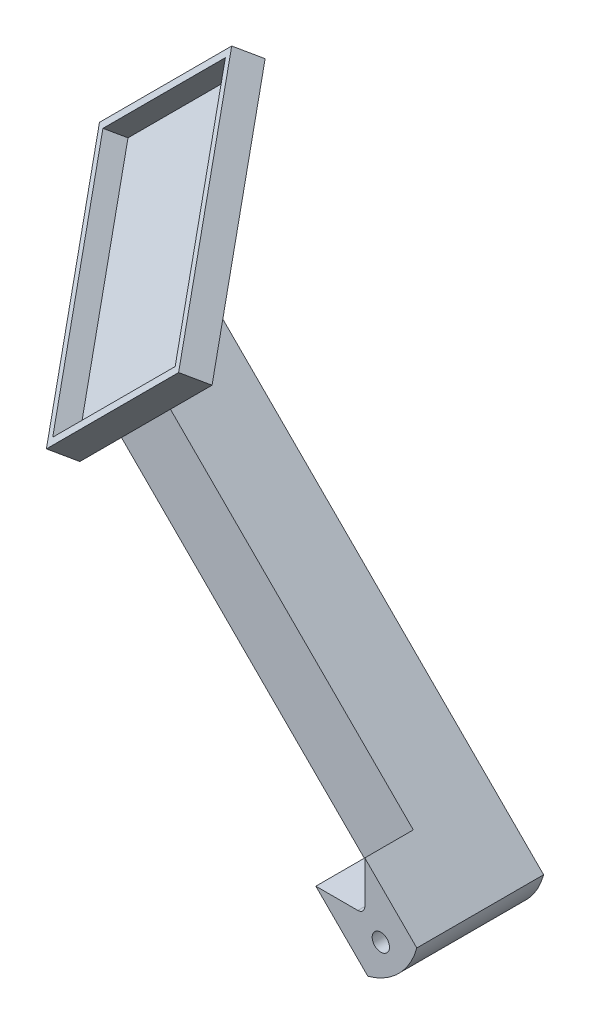
ISO-10303-21;
HEADER;
FILE_DESCRIPTION(('STEP AP214'),'2;1');
FILE_NAME('part.step','',(''),(''),'','','');
FILE_SCHEMA(('AUTOMOTIVE_DESIGN { 1 0 10303 214 1 1 1 1 }'));
ENDSEC;
DATA;
#1=APPLICATION_CONTEXT('core data for automotive mechanical design processes');
#2=APPLICATION_PROTOCOL_DEFINITION('international standard','automotive_design',2000,#1);
#3=PRODUCT_CONTEXT('',#1,'mechanical');
#4=PRODUCT('Part','Part','',(#3));
#5=PRODUCT_RELATED_PRODUCT_CATEGORY('part','',(#4));
#6=PRODUCT_DEFINITION_FORMATION('','',#4);
#7=PRODUCT_DEFINITION_CONTEXT('part definition',#1,'design');
#8=PRODUCT_DEFINITION('design','',#6,#7);
#9=PRODUCT_DEFINITION_SHAPE('','',#8);
#10=(LENGTH_UNIT() NAMED_UNIT(*) SI_UNIT(.MILLI.,.METRE.));
#11=(NAMED_UNIT(*) PLANE_ANGLE_UNIT() SI_UNIT($,.RADIAN.));
#12=(NAMED_UNIT(*) SI_UNIT($,.STERADIAN.) SOLID_ANGLE_UNIT());
#13=UNCERTAINTY_MEASURE_WITH_UNIT(LENGTH_MEASURE(1.E-05),#10,'distance_accuracy_value','');
#14=(GEOMETRIC_REPRESENTATION_CONTEXT(3) GLOBAL_UNCERTAINTY_ASSIGNED_CONTEXT((#13)) GLOBAL_UNIT_ASSIGNED_CONTEXT((#10,
#11,#12)) REPRESENTATION_CONTEXT('',''));
#15=CARTESIAN_POINT('',(0.,0.,0.));
#16=DIRECTION('',(0.,0.,1.));
#17=DIRECTION('',(1.,0.,0.));
#18=AXIS2_PLACEMENT_3D('',#15,#16,#17);
#19=CARTESIAN_POINT('',(-16.5000000000001,58.0000000000001,-5.));
#20=DIRECTION('',(0.,0.,-1.));
#21=DIRECTION('',(-1.,0.,0.));
#22=AXIS2_PLACEMENT_3D('',#19,#20,#21);
#23=PLANE('',#22);
#24=CARTESIAN_POINT('',(48.0000000000001,-48.0000000000001,-5.));
#25=DIRECTION('',(0.,0.,-1.));
#26=DIRECTION('',(-1.,0.,0.));
#27=AXIS2_PLACEMENT_3D('',#24,#25,#26);
#28=CIRCLE('',#27,10.);
#29=CARTESIAN_POINT('',(50.5881904510253,-57.6592582628908,-5.));
#30=VERTEX_POINT('',#29);
#31=CARTESIAN_POINT('',(57.6592582628908,-50.5881904510253,-5.));
#32=VERTEX_POINT('',#31);
#33=EDGE_CURVE('E164',#30,#32,#28,.F.);
#34=ORIENTED_EDGE('',*,*,#33,.T.);
#35=DIRECTION('',(0.707106781186548,-0.707106781186547,0.));
#36=VECTOR('',#35,1.);
#37=CARTESIAN_POINT('',(53.6874140659327,-46.6163462540672,-5.));
#38=LINE('',#37,#36);
#39=CARTESIAN_POINT('',(50.15188016,-43.0808123481345,-5.));
#40=VERTEX_POINT('',#39);
#41=EDGE_CURVE('E185',#40,#32,#38,.T.);
#42=ORIENTED_EDGE('',*,*,#41,.F.);
#43=DIRECTION('',(0.,-1.,0.));
#44=VECTOR('',#43,1.);
#45=CARTESIAN_POINT('',(50.15188016,0.,-5.));
#46=LINE('',#45,#44);
#47=CARTESIAN_POINT('',(50.15188016,-49.15188016,-5.));
#48=VERTEX_POINT('',#47);
#49=EDGE_CURVE('E53',#40,#48,#46,.T.);
#50=ORIENTED_EDGE('',*,*,#49,.T.);
#51=CARTESIAN_POINT('',(49.15188016,-49.15188016,-5.));
#52=DIRECTION('',(0.,0.,-1.));
#53=DIRECTION('',(-1.,0.,0.));
#54=AXIS2_PLACEMENT_3D('',#51,#52,#53);
#55=CIRCLE('',#54,1.);
#56=CARTESIAN_POINT('',(49.15188016,-50.15188016,-5.));
#57=VERTEX_POINT('',#56);
#58=EDGE_CURVE('E168',#57,#48,#55,.F.);
#59=ORIENTED_EDGE('',*,*,#58,.F.);
#60=DIRECTION('',(-1.,0.,0.));
#61=VECTOR('',#60,1.);
#62=CARTESIAN_POINT('',(0.,-50.15188016,-5.));
#63=LINE('',#62,#61);
#64=CARTESIAN_POINT('',(43.0808123481345,-50.15188016,-5.));
#65=VERTEX_POINT('',#64);
#66=EDGE_CURVE('E166',#57,#65,#63,.T.);
#67=ORIENTED_EDGE('',*,*,#66,.T.);
#68=DIRECTION('',(0.707106781186548,-0.707106781186547,0.));
#69=VECTOR('',#68,1.);
#70=CARTESIAN_POINT('',(46.6163462540672,-53.6874140659327,-5.));
#71=LINE('',#70,#69);
#72=EDGE_CURVE('E40',#65,#30,#71,.T.);
#73=ORIENTED_EDGE('',*,*,#72,.T.);
#74=EDGE_LOOP('',(#34,#42,#50,#59,#67,#73));
#75=FACE_BOUND('',#74,.T.);
#76=CARTESIAN_POINT('',(52.4653793231931,-52.4653793231931,-5.));
#77=DIRECTION('',(0.,0.,-1.));
#78=DIRECTION('',(-1.,0.,0.));
#79=AXIS2_PLACEMENT_3D('',#76,#77,#78);
#80=CIRCLE('',#79,1.24999999999999);
#81=CARTESIAN_POINT('',(51.2153793231931,-52.4653793231931,-5.));
#82=VERTEX_POINT('',#81);
#83=EDGE_CURVE('E294',#82,#82,#80,.F.);
#84=ORIENTED_EDGE('',*,*,#83,.F.);
#85=EDGE_LOOP('',(#84));
#86=FACE_BOUND('',#85,.T.);
#87=ADVANCED_FACE('F37',(#75,#86),#23,.F.);
#88=CARTESIAN_POINT('',(9.51771845904715,-9.51771845904715,-13.4600865276334));
#89=DIRECTION('',(-0.499999999999996,0.499999999999996,0.707106781186553));
#90=DIRECTION('',(0.81649658092773,0.,0.57735026918962));
#91=AXIS2_PLACEMENT_3D('',#88,#89,#90);
#92=PLANE('',#91);
#93=DIRECTION('',(0.707106781186547,0.707106781186548,0.));
#94=VECTOR('',#93,1.);
#95=CARTESIAN_POINT('',(10.5501555438559,-10.5501555438559,-12.));
#96=LINE('',#95,#94);
#97=CARTESIAN_POINT('',(1.71132077902406,-19.3889903086877,-12.));
#98=VERTEX_POINT('',#97);
#99=CARTESIAN_POINT('',(19.3889903086877,-1.71132077902405,-12.));
#100=VERTEX_POINT('',#99);
#101=EDGE_CURVE('E45',#98,#100,#96,.T.);
#102=ORIENTED_EDGE('',*,*,#101,.T.);
#103=DIRECTION('',(-0.500000000000004,0.500000000000003,-0.707106781186542));
#104=VECTOR('',#103,1.);
#105=CARTESIAN_POINT('',(18.356553223879,-0.678883694215297,-13.4600865276334));
#106=LINE('',#105,#104);
#107=CARTESIAN_POINT('',(1.88899030868757,15.7886792209761,-36.748737341529));
#108=VERTEX_POINT('',#107);
#109=EDGE_CURVE('E246',#100,#108,#106,.T.);
#110=ORIENTED_EDGE('',*,*,#109,.T.);
#111=DIRECTION('',(-0.707106781186547,-0.707106781186548,0.));
#112=VECTOR('',#111,1.);
#113=CARTESIAN_POINT('',(-6.94984445614426,6.94984445614423,-36.748737341529));
#114=LINE('',#113,#112);
#115=CARTESIAN_POINT('',(-15.7886792209761,-1.88899030868762,-36.748737341529));
#116=VERTEX_POINT('',#115);
#117=EDGE_CURVE('E243',#108,#116,#114,.T.);
#118=ORIENTED_EDGE('',*,*,#117,.T.);
#119=DIRECTION('',(0.500000000000004,-0.500000000000003,0.707106781186542));
#120=VECTOR('',#119,1.);
#121=CARTESIAN_POINT('',(0.678883694215319,-18.356553223879,-13.4600865276334));
#122=LINE('',#121,#120);
#123=EDGE_CURVE('E240',#116,#98,#122,.T.);
#124=ORIENTED_EDGE('',*,*,#123,.T.);
#125=EDGE_LOOP('',(#102,#110,#118,#124));
#126=FACE_BOUND('',#125,.T.);
#127=ADVANCED_FACE('F303',(#126),#92,.T.);
#128=CARTESIAN_POINT('',(0.388990308687586,17.2886792209761,-34.6274169979693));
#129=DIRECTION('',(0.500000000000004,-0.500000000000003,0.707106781186542));
#130=DIRECTION('',(0.816496580927722,0.,-0.577350269189632));
#131=AXIS2_PLACEMENT_3D('',#128,#129,#130);
#132=PLANE('',#131);
#133=ORIENTED_EDGE('',*,*,#117,.F.);
#134=DIRECTION('',(0.499999999999996,-0.499999999999996,-0.707106781186553));
#135=VECTOR('',#134,1.);
#136=CARTESIAN_POINT('',(0.388990308687586,17.2886792209761,-34.6274169979693));
#137=LINE('',#136,#135);
#138=CARTESIAN_POINT('',(0.388990308687586,17.2886792209761,-34.6274169979693));
#139=VERTEX_POINT('',#138);
#140=EDGE_CURVE('E214',#139,#108,#137,.T.);
#141=ORIENTED_EDGE('',*,*,#140,.F.);
#142=DIRECTION('',(-0.707106781186547,-0.707106781186548,0.));
#143=VECTOR('',#142,1.);
#144=CARTESIAN_POINT('',(0.388990308687586,17.2886792209761,-34.6274169979693));
#145=LINE('',#144,#143);
#146=CARTESIAN_POINT('',(-17.2886792209761,-0.388990308687629,-34.6274169979693));
#147=VERTEX_POINT('',#146);
#148=EDGE_CURVE('E236',#139,#147,#145,.T.);
#149=ORIENTED_EDGE('',*,*,#148,.T.);
#150=DIRECTION('',(0.499999999999996,-0.499999999999996,-0.707106781186553));
#151=VECTOR('',#150,1.);
#152=CARTESIAN_POINT('',(-17.2886792209761,-0.388990308687629,-34.6274169979693));
#153=LINE('',#152,#151);
#154=EDGE_CURVE('E224',#147,#116,#153,.T.);
#155=ORIENTED_EDGE('',*,*,#154,.T.);
#156=EDGE_LOOP('',(#133,#141,#149,#155));
#157=FACE_BOUND('',#156,.T.);
#158=ADVANCED_FACE('F307',(#157),#132,.T.);
#159=CARTESIAN_POINT('',(-17.2886792209761,-0.388990308687629,-34.6274169979693));
#160=DIRECTION('',(0.707106781186547,0.707106781186548,0.));
#161=DIRECTION('',(-0.707106781186548,0.707106781186547,0.));
#162=AXIS2_PLACEMENT_3D('',#159,#160,#161);
#163=PLANE('',#162);
#164=ORIENTED_EDGE('',*,*,#123,.F.);
#165=ORIENTED_EDGE('',*,*,#154,.F.);
#166=DIRECTION('',(0.500000000000004,-0.500000000000003,0.707106781186542));
#167=VECTOR('',#166,1.);
#168=CARTESIAN_POINT('',(-17.2886792209761,-0.388990308687629,-34.6274169979693));
#169=LINE('',#168,#167);
#170=CARTESIAN_POINT('',(0.211320779024074,-17.8889903086878,-9.87867965644032));
#171=VERTEX_POINT('',#170);
#172=EDGE_CURVE('E233',#147,#171,#169,.T.);
#173=ORIENTED_EDGE('',*,*,#172,.T.);
#174=DIRECTION('',(0.499999999999996,-0.499999999999996,-0.707106781186553));
#175=VECTOR('',#174,1.);
#176=CARTESIAN_POINT('',(0.211320779024073,-17.8889903086878,-9.87867965644032));
#177=LINE('',#176,#175);
#178=EDGE_CURVE('E227',#171,#98,#177,.T.);
#179=ORIENTED_EDGE('',*,*,#178,.T.);
#180=EDGE_LOOP('',(#164,#165,#173,#179));
#181=FACE_BOUND('',#180,.T.);
#182=ADVANCED_FACE('F362',(#181),#163,.T.);
#183=CARTESIAN_POINT('',(0.211320779024073,-17.8889903086878,-9.87867965644032));
#184=DIRECTION('',(-0.500000000000004,0.500000000000003,-0.707106781186542));
#185=DIRECTION('',(-0.816496580927722,0.,0.577350269189632));
#186=AXIS2_PLACEMENT_3D('',#183,#184,#185);
#187=PLANE('',#186);
#188=ORIENTED_EDGE('',*,*,#101,.F.);
#189=ORIENTED_EDGE('',*,*,#178,.F.);
#190=DIRECTION('',(0.707106781186547,0.707106781186548,0.));
#191=VECTOR('',#190,1.);
#192=CARTESIAN_POINT('',(0.211320779024073,-17.8889903086878,-9.87867965644032));
#193=LINE('',#192,#191);
#194=CARTESIAN_POINT('',(17.8889903086878,-0.211320779024059,-9.87867965644032));
#195=VERTEX_POINT('',#194);
#196=EDGE_CURVE('E231',#171,#195,#193,.T.);
#197=ORIENTED_EDGE('',*,*,#196,.T.);
#198=DIRECTION('',(0.499999999999996,-0.499999999999996,-0.707106781186553));
#199=VECTOR('',#198,1.);
#200=CARTESIAN_POINT('',(17.8889903086878,-0.211320779024059,-9.87867965644032));
#201=LINE('',#200,#199);
#202=EDGE_CURVE('E61',#195,#100,#201,.T.);
#203=ORIENTED_EDGE('',*,*,#202,.T.);
#204=EDGE_LOOP('',(#188,#189,#197,#203));
#205=FACE_BOUND('',#204,.T.);
#206=ADVANCED_FACE('F358',(#205),#187,.T.);
#207=CARTESIAN_POINT('',(17.8889903086878,-0.211320779024059,-9.87867965644032));
#208=DIRECTION('',(-0.707106781186547,-0.707106781186548,0.));
#209=DIRECTION('',(0.707106781186548,-0.707106781186547,0.));
#210=AXIS2_PLACEMENT_3D('',#207,#208,#209);
#211=PLANE('',#210);
#212=ORIENTED_EDGE('',*,*,#109,.F.);
#213=ORIENTED_EDGE('',*,*,#202,.F.);
#214=DIRECTION('',(-0.500000000000004,0.500000000000003,-0.707106781186542));
#215=VECTOR('',#214,1.);
#216=CARTESIAN_POINT('',(17.8889903086878,-0.211320779024059,-9.87867965644032));
#217=LINE('',#216,#215);
#218=EDGE_CURVE('E238',#195,#139,#217,.T.);
#219=ORIENTED_EDGE('',*,*,#218,.T.);
#220=ORIENTED_EDGE('',*,*,#140,.T.);
#221=EDGE_LOOP('',(#212,#213,#219,#220));
#222=FACE_BOUND('',#221,.T.);
#223=ADVANCED_FACE('F354',(#222),#211,.T.);
#224=CARTESIAN_POINT('',(8.01771845904717,-8.01771845904717,-11.3387661840738));
#225=DIRECTION('',(0.499999999999997,-0.499999999999996,-0.707106781186553));
#226=DIRECTION('',(-0.81649658092773,0.,-0.57735026918962));
#227=AXIS2_PLACEMENT_3D('',#224,#225,#226);
#228=PLANE('',#227);
#229=DIRECTION('',(0.500000000000004,-0.500000000000003,0.707106781186542));
#230=VECTOR('',#229,1.);
#231=CARTESIAN_POINT('',(0.00421399783751041,-19.0960970898743,-9.17157287525379));
#232=LINE('',#231,#230);
#233=CARTESIAN_POINT('',(-18.4957860021626,-0.59609708987418,-35.3345237791559));
#234=VERTEX_POINT('',#233);
#235=CARTESIAN_POINT('',(0.00421399783751041,-19.0960970898743,-9.17157287525379));
#236=VERTEX_POINT('',#235);
#237=EDGE_CURVE('E205',#234,#236,#232,.T.);
#238=ORIENTED_EDGE('',*,*,#237,.T.);
#239=DIRECTION('',(0.707106781186547,0.707106781186548,0.));
#240=VECTOR('',#239,1.);
#241=CARTESIAN_POINT('',(0.00421399783751041,-19.0960970898743,-9.17157287525379));
#242=LINE('',#241,#240);
#243=CARTESIAN_POINT('',(19.0960970898743,-0.0042139978374987,-9.1715728752538));
#244=VERTEX_POINT('',#243);
#245=EDGE_CURVE('E218',#236,#244,#242,.T.);
#246=ORIENTED_EDGE('',*,*,#245,.T.);
#247=DIRECTION('',(-0.500000000000004,0.500000000000003,-0.707106781186542));
#248=VECTOR('',#247,1.);
#249=CARTESIAN_POINT('',(0.596097089874139,18.4957860021626,-35.3345237791559));
#250=LINE('',#249,#248);
#251=CARTESIAN_POINT('',(0.596097089874139,18.4957860021626,-35.3345237791559));
#252=VERTEX_POINT('',#251);
#253=EDGE_CURVE('E216',#244,#252,#250,.T.);
#254=ORIENTED_EDGE('',*,*,#253,.T.);
#255=DIRECTION('',(-0.707106781186547,-0.707106781186548,0.));
#256=VECTOR('',#255,1.);
#257=CARTESIAN_POINT('',(-18.4957860021626,-0.59609708987418,-35.3345237791559));
#258=LINE('',#257,#256);
#259=EDGE_CURVE('E201',#252,#234,#258,.T.);
#260=ORIENTED_EDGE('',*,*,#259,.T.);
#261=EDGE_LOOP('',(#238,#246,#254,#260));
#262=FACE_BOUND('',#261,.T.);
#263=ORIENTED_EDGE('',*,*,#218,.F.);
#264=ORIENTED_EDGE('',*,*,#196,.F.);
#265=ORIENTED_EDGE('',*,*,#172,.F.);
#266=ORIENTED_EDGE('',*,*,#148,.F.);
#267=EDGE_LOOP('',(#263,#264,#265,#266));
#268=FACE_BOUND('',#267,.T.);
#269=ADVANCED_FACE('F344',(#262,#268),#228,.F.);
#270=CARTESIAN_POINT('',(0.596097089874139,18.4957860021626,-35.3345237791559));
#271=DIRECTION('',(-0.707106781186547,-0.707106781186548,0.));
#272=DIRECTION('',(0.707106781186548,-0.707106781186547,0.));
#273=AXIS2_PLACEMENT_3D('',#270,#271,#272);
#274=PLANE('',#273);
#275=DIRECTION('',(-0.500000000000004,0.500000000000003,-0.707106781186542));
#276=VECTOR('',#275,1.);
#277=CARTESIAN_POINT('',(2.59609708987412,16.4957860021626,-38.1629509039021));
#278=LINE('',#277,#276);
#279=CARTESIAN_POINT('',(21.0960970898743,-2.00421399783748,-12.));
#280=VERTEX_POINT('',#279);
#281=CARTESIAN_POINT('',(2.59609708987412,16.4957860021626,-38.1629509039021));
#282=VERTEX_POINT('',#281);
#283=EDGE_CURVE('E204',#280,#282,#278,.T.);
#284=ORIENTED_EDGE('',*,*,#283,.T.);
#285=DIRECTION('',(0.499999999999996,-0.499999999999996,-0.707106781186553));
#286=VECTOR('',#285,1.);
#287=CARTESIAN_POINT('',(0.596097089874139,18.4957860021626,-35.3345237791559));
#288=LINE('',#287,#286);
#289=EDGE_CURVE('E195',#252,#282,#288,.T.);
#290=ORIENTED_EDGE('',*,*,#289,.F.);
#291=ORIENTED_EDGE('',*,*,#253,.F.);
#292=DIRECTION('',(0.499999999999996,-0.499999999999996,-0.707106781186553));
#293=VECTOR('',#292,1.);
#294=CARTESIAN_POINT('',(19.0960970898743,-0.0042139978374987,-9.1715728752538));
#295=LINE('',#294,#293);
#296=EDGE_CURVE('E192',#244,#280,#295,.T.);
#297=ORIENTED_EDGE('',*,*,#296,.T.);
#298=EDGE_LOOP('',(#284,#290,#291,#297));
#299=FACE_BOUND('',#298,.T.);
#300=ADVANCED_FACE('F341',(#299),#274,.F.);
#301=CARTESIAN_POINT('',(-18.4957860021626,-0.59609708987418,-35.3345237791559));
#302=DIRECTION('',(0.500000000000004,-0.500000000000003,0.707106781186542));
#303=DIRECTION('',(0.816496580927722,0.,-0.577350269189632));
#304=AXIS2_PLACEMENT_3D('',#301,#302,#303);
#305=PLANE('',#304);
#306=DIRECTION('',(-0.707106781186547,-0.707106781186548,0.));
#307=VECTOR('',#306,1.);
#308=CARTESIAN_POINT('',(-16.4957860021627,-2.59609708987417,-38.1629509039021));
#309=LINE('',#308,#307);
#310=CARTESIAN_POINT('',(-16.4957860021627,-2.59609708987417,-38.1629509039021));
#311=VERTEX_POINT('',#310);
#312=EDGE_CURVE('E202',#282,#311,#309,.T.);
#313=ORIENTED_EDGE('',*,*,#312,.T.);
#314=DIRECTION('',(0.499999999999996,-0.499999999999996,-0.707106781186553));
#315=VECTOR('',#314,1.);
#316=CARTESIAN_POINT('',(-18.4957860021626,-0.59609708987418,-35.3345237791559));
#317=LINE('',#316,#315);
#318=EDGE_CURVE('E198',#234,#311,#317,.T.);
#319=ORIENTED_EDGE('',*,*,#318,.F.);
#320=ORIENTED_EDGE('',*,*,#259,.F.);
#321=ORIENTED_EDGE('',*,*,#289,.T.);
#322=EDGE_LOOP('',(#313,#319,#320,#321));
#323=FACE_BOUND('',#322,.T.);
#324=ADVANCED_FACE('F336',(#323),#305,.F.);
#325=CARTESIAN_POINT('',(0.00421399783751041,-19.0960970898743,-9.17157287525379));
#326=DIRECTION('',(0.707106781186547,0.707106781186548,0.));
#327=DIRECTION('',(-0.707106781186548,0.707106781186547,0.));
#328=AXIS2_PLACEMENT_3D('',#325,#326,#327);
#329=PLANE('',#328);
#330=DIRECTION('',(0.500000000000004,-0.500000000000003,0.707106781186542));
#331=VECTOR('',#330,1.);
#332=CARTESIAN_POINT('',(2.0042139978375,-21.0960970898743,-12.));
#333=LINE('',#332,#331);
#334=CARTESIAN_POINT('',(2.0042139978375,-21.0960970898743,-12.));
#335=VERTEX_POINT('',#334);
#336=EDGE_CURVE('E211',#311,#335,#333,.T.);
#337=ORIENTED_EDGE('',*,*,#336,.T.);
#338=DIRECTION('',(0.499999999999996,-0.499999999999996,-0.707106781186553));
#339=VECTOR('',#338,1.);
#340=CARTESIAN_POINT('',(0.00421399783751041,-19.0960970898743,-9.17157287525379));
#341=LINE('',#340,#339);
#342=EDGE_CURVE('E178',#236,#335,#341,.T.);
#343=ORIENTED_EDGE('',*,*,#342,.F.);
#344=ORIENTED_EDGE('',*,*,#237,.F.);
#345=ORIENTED_EDGE('',*,*,#318,.T.);
#346=EDGE_LOOP('',(#337,#343,#344,#345));
#347=FACE_BOUND('',#346,.T.);
#348=ADVANCED_FACE('F332',(#347),#329,.F.);
#349=CARTESIAN_POINT('',(0.00421399783751041,-19.0960970898743,-9.17157287525379));
#350=DIRECTION('',(-0.500000000000004,0.500000000000003,-0.707106781186542));
#351=DIRECTION('',(-0.816496580927722,0.,0.577350269189632));
#352=AXIS2_PLACEMENT_3D('',#349,#350,#351);
#353=PLANE('',#352);
#354=DIRECTION('',(0.707106781186547,0.707106781186548,0.));
#355=VECTOR('',#354,1.);
#356=CARTESIAN_POINT('',(2.0042139978375,-21.0960970898743,-12.));
#357=LINE('',#356,#355);
#358=CARTESIAN_POINT('',(8.01462163792313,-15.0856894497886,-12.));
#359=VERTEX_POINT('',#358);
#360=EDGE_CURVE('E207',#335,#359,#357,.T.);
#361=ORIENTED_EDGE('',*,*,#360,.T.);
#362=DIRECTION('',(-0.707106781186547,-0.707106781186548,0.));
#363=VECTOR('',#362,1.);
#364=CARTESIAN_POINT('',(15.0856894497886,-8.01462163792315,-12.));
#365=LINE('',#364,#363);
#366=CARTESIAN_POINT('',(15.0856894497886,-8.01462163792315,-12.));
#367=VERTEX_POINT('',#366);
#368=EDGE_CURVE('E272',#367,#359,#365,.T.);
#369=ORIENTED_EDGE('',*,*,#368,.F.);
#370=EDGE_CURVE('E210',#367,#280,#357,.T.);
#371=ORIENTED_EDGE('',*,*,#370,.T.);
#372=ORIENTED_EDGE('',*,*,#296,.F.);
#373=ORIENTED_EDGE('',*,*,#245,.F.);
#374=ORIENTED_EDGE('',*,*,#342,.T.);
#375=EDGE_LOOP('',(#361,#369,#371,#372,#373,#374));
#376=FACE_BOUND('',#375,.T.);
#377=ADVANCED_FACE('F335',(#376),#353,.F.);
#378=CARTESIAN_POINT('',(10.0177184590472,-10.0177184590471,-14.16719330882));
#379=DIRECTION('',(0.499999999999997,-0.499999999999996,-0.707106781186553));
#380=DIRECTION('',(-0.81649658092773,0.,-0.57735026918962));
#381=AXIS2_PLACEMENT_3D('',#378,#379,#380);
#382=PLANE('',#381);
#383=DIRECTION('',(0.500000000000004,-0.500000000000004,0.707106781186542));
#384=VECTOR('',#383,1.);
#385=CARTESIAN_POINT('',(0.0172439427031834,-7.08831175456866,-23.31));
#386=LINE('',#385,#384);
#387=CARTESIAN_POINT('',(0.0172439427031604,-7.08831175456868,-23.31));
#388=VERTEX_POINT('',#387);
#389=EDGE_CURVE('E278',#388,#359,#386,.T.);
#390=ORIENTED_EDGE('',*,*,#389,.T.);
#391=ORIENTED_EDGE('',*,*,#360,.F.);
#392=ORIENTED_EDGE('',*,*,#336,.F.);
#393=ORIENTED_EDGE('',*,*,#312,.F.);
#394=ORIENTED_EDGE('',*,*,#283,.F.);
#395=ORIENTED_EDGE('',*,*,#370,.F.);
#396=DIRECTION('',(0.500000000000004,-0.500000000000004,0.707106781186542));
#397=VECTOR('',#396,1.);
#398=CARTESIAN_POINT('',(7.08831175456866,-0.0172439427031821,-23.31));
#399=LINE('',#398,#397);
#400=CARTESIAN_POINT('',(7.08831175456868,-0.0172439427031821,-23.31));
#401=VERTEX_POINT('',#400);
#402=EDGE_CURVE('E283',#401,#367,#399,.T.);
#403=ORIENTED_EDGE('',*,*,#402,.F.);
#404=DIRECTION('',(-0.707106781186547,-0.707106781186548,0.));
#405=VECTOR('',#404,1.);
#406=CARTESIAN_POINT('',(7.08831175456866,-0.0172439427031821,-23.31));
#407=LINE('',#406,#405);
#408=EDGE_CURVE('E269',#401,#388,#407,.T.);
#409=ORIENTED_EDGE('',*,*,#408,.T.);
#410=EDGE_LOOP('',(#390,#391,#392,#393,#394,#395,#403,#409));
#411=FACE_BOUND('',#410,.T.);
#412=ADVANCED_FACE('F328',(#411),#382,.T.);
#413=CARTESIAN_POINT('',(3.53553390593271,3.53553390593271,0.));
#414=DIRECTION('',(0.707106781186547,0.707106781186548,0.));
#415=DIRECTION('',(-0.707106781186548,0.707106781186547,0.));
#416=AXIS2_PLACEMENT_3D('',#413,#414,#415);
#417=PLANE('',#416);
#418=ORIENTED_EDGE('',*,*,#41,.T.);
#419=DIRECTION('',(0.,0.,-1.));
#420=VECTOR('',#419,1.);
#421=CARTESIAN_POINT('',(57.6592582628908,-50.5881904510253,-5.));
#422=LINE('',#421,#420);
#423=CARTESIAN_POINT('',(57.6592582628908,-50.5881904510253,-23.31));
#424=VERTEX_POINT('',#423);
#425=EDGE_CURVE('E258',#32,#424,#422,.T.);
#426=ORIENTED_EDGE('',*,*,#425,.T.);
#427=DIRECTION('',(-0.707106781186548,0.707106781186547,0.));
#428=VECTOR('',#427,1.);
#429=CARTESIAN_POINT('',(61.5355339059328,-54.4644660940673,-23.31));
#430=LINE('',#429,#428);
#431=EDGE_CURVE('E284',#424,#401,#430,.T.);
#432=ORIENTED_EDGE('',*,*,#431,.T.);
#433=ORIENTED_EDGE('',*,*,#402,.T.);
#434=DIRECTION('',(0.707106781186548,-0.707106781186547,0.));
#435=VECTOR('',#434,1.);
#436=CARTESIAN_POINT('',(15.0856894497886,-8.01462163792315,-12.));
#437=LINE('',#436,#435);
#438=CARTESIAN_POINT('',(50.15188016,-43.0808123481345,-12.));
#439=VERTEX_POINT('',#438);
#440=EDGE_CURVE('E275',#367,#439,#437,.T.);
#441=ORIENTED_EDGE('',*,*,#440,.T.);
#442=DIRECTION('',(0.,0.,1.));
#443=VECTOR('',#442,1.);
#444=CARTESIAN_POINT('',(50.15188016,-43.0808123481345,-27.));
#445=LINE('',#444,#443);
#446=EDGE_CURVE('E181',#439,#40,#445,.T.);
#447=ORIENTED_EDGE('',*,*,#446,.T.);
#448=EDGE_LOOP('',(#418,#426,#432,#433,#441,#447));
#449=FACE_BOUND('',#448,.T.);
#450=ADVANCED_FACE('F286',(#449),#417,.T.);
#451=CARTESIAN_POINT('',(61.5355339059328,-54.4644660940673,-23.31));
#452=DIRECTION('',(0.,0.,1.));
#453=DIRECTION('',(1.,0.,0.));
#454=AXIS2_PLACEMENT_3D('',#451,#452,#453);
#455=PLANE('',#454);
#456=CARTESIAN_POINT('',(52.4653793231931,-52.4653793231931,-23.31));
#457=DIRECTION('',(0.,0.,-1.));
#458=DIRECTION('',(0.,1.,0.));
#459=AXIS2_PLACEMENT_3D('',#456,#457,#458);
#460=CIRCLE('',#459,1.24999999999999);
#461=CARTESIAN_POINT('',(52.4653793231931,-51.2153793231931,-23.31));
#462=VERTEX_POINT('',#461);
#463=EDGE_CURVE('E11',#462,#462,#460,.T.);
#464=ORIENTED_EDGE('',*,*,#463,.F.);
#465=EDGE_LOOP('',(#464));
#466=FACE_BOUND('',#465,.T.);
#467=ORIENTED_EDGE('',*,*,#431,.F.);
#468=CARTESIAN_POINT('',(48.0000000000001,-48.0000000000001,-23.31));
#469=DIRECTION('',(0.,0.,1.));
#470=DIRECTION('',(1.,0.,0.));
#471=AXIS2_PLACEMENT_3D('',#468,#469,#470);
#472=CIRCLE('',#471,10.);
#473=CARTESIAN_POINT('',(50.5881904510253,-57.6592582628907,-23.31));
#474=VERTEX_POINT('',#473);
#475=EDGE_CURVE('E260',#424,#474,#472,.F.);
#476=ORIENTED_EDGE('',*,*,#475,.T.);
#477=DIRECTION('',(-0.707106781186548,0.707106781186547,0.));
#478=VECTOR('',#477,1.);
#479=CARTESIAN_POINT('',(54.4644660940673,-61.5355339059328,-23.31));
#480=LINE('',#479,#478);
#481=EDGE_CURVE('E188',#474,#388,#480,.T.);
#482=ORIENTED_EDGE('',*,*,#481,.T.);
#483=ORIENTED_EDGE('',*,*,#408,.F.);
#484=EDGE_LOOP('',(#467,#476,#482,#483));
#485=FACE_BOUND('',#484,.T.);
#486=ADVANCED_FACE('F318',(#466,#485),#455,.F.);
#487=CARTESIAN_POINT('',(52.4653793231931,-52.4653793231931,-23.31));
#488=DIRECTION('',(0.,0.,-1.));
#489=DIRECTION('',(0.,1.,0.));
#490=AXIS2_PLACEMENT_3D('',#487,#488,#489);
#491=CYLINDRICAL_SURFACE('',#490,1.24999999999999);
#492=ORIENTED_EDGE('',*,*,#83,.T.);
#493=EDGE_LOOP('',(#492));
#494=FACE_BOUND('',#493,.T.);
#495=ORIENTED_EDGE('',*,*,#463,.T.);
#496=EDGE_LOOP('',(#495));
#497=FACE_BOUND('',#496,.T.);
#498=ADVANCED_FACE('F300',(#494,#497),#491,.F.);
#499=CARTESIAN_POINT('',(-3.53553390593276,-3.53553390593276,0.));
#500=DIRECTION('',(0.707106781186547,0.707106781186548,0.));
#501=DIRECTION('',(-0.707106781186548,0.707106781186547,0.));
#502=AXIS2_PLACEMENT_3D('',#499,#500,#501);
#503=PLANE('',#502);
#504=ORIENTED_EDGE('',*,*,#481,.F.);
#505=DIRECTION('',(0.,0.,-1.));
#506=VECTOR('',#505,1.);
#507=CARTESIAN_POINT('',(50.5881904510253,-57.6592582628907,-23.31));
#508=LINE('',#507,#506);
#509=EDGE_CURVE('E160',#474,#30,#508,.F.);
#510=ORIENTED_EDGE('',*,*,#509,.T.);
#511=ORIENTED_EDGE('',*,*,#72,.F.);
#512=DIRECTION('',(0.,0.,1.));
#513=VECTOR('',#512,1.);
#514=CARTESIAN_POINT('',(43.0808123481345,-50.15188016,-27.));
#515=LINE('',#514,#513);
#516=CARTESIAN_POINT('',(43.0808123481345,-50.15188016,-12.));
#517=VERTEX_POINT('',#516);
#518=EDGE_CURVE('E158',#517,#65,#515,.T.);
#519=ORIENTED_EDGE('',*,*,#518,.F.);
#520=DIRECTION('',(0.707106781186548,-0.707106781186547,0.));
#521=VECTOR('',#520,1.);
#522=CARTESIAN_POINT('',(8.01462163792315,-15.0856894497886,-12.));
#523=LINE('',#522,#521);
#524=EDGE_CURVE('E276',#359,#517,#523,.T.);
#525=ORIENTED_EDGE('',*,*,#524,.F.);
#526=ORIENTED_EDGE('',*,*,#389,.F.);
#527=EDGE_LOOP('',(#504,#510,#511,#519,#525,#526));
#528=FACE_BOUND('',#527,.T.);
#529=ADVANCED_FACE('F155',(#528),#503,.F.);
#530=CARTESIAN_POINT('',(48.0000000000001,-48.0000000000001,5.));
#531=DIRECTION('',(0.,0.,-1.));
#532=DIRECTION('',(-1.,0.,0.));
#533=AXIS2_PLACEMENT_3D('',#530,#531,#532);
#534=CYLINDRICAL_SURFACE('',#533,10.);
#535=ORIENTED_EDGE('',*,*,#33,.F.);
#536=ORIENTED_EDGE('',*,*,#509,.F.);
#537=ORIENTED_EDGE('',*,*,#475,.F.);
#538=ORIENTED_EDGE('',*,*,#425,.F.);
#539=EDGE_LOOP('',(#535,#536,#537,#538));
#540=FACE_BOUND('',#539,.T.);
#541=ADVANCED_FACE('F259',(#540),#534,.T.);
#542=CARTESIAN_POINT('',(15.0856894497886,-8.01462163792315,-12.));
#543=DIRECTION('',(0.,0.,-1.));
#544=DIRECTION('',(-1.,0.,0.));
#545=AXIS2_PLACEMENT_3D('',#542,#543,#544);
#546=PLANE('',#545);
#547=DIRECTION('',(-1.,0.,0.));
#548=VECTOR('',#547,1.);
#549=CARTESIAN_POINT('',(0.,-50.15188016,-12.));
#550=LINE('',#549,#548);
#551=CARTESIAN_POINT('',(49.15188016,-50.15188016,-12.));
#552=VERTEX_POINT('',#551);
#553=EDGE_CURVE('E174',#552,#517,#550,.T.);
#554=ORIENTED_EDGE('',*,*,#553,.F.);
#555=CARTESIAN_POINT('',(49.15188016,-49.15188016,-12.));
#556=DIRECTION('',(0.,0.,-1.));
#557=DIRECTION('',(-1.,0.,0.));
#558=AXIS2_PLACEMENT_3D('',#555,#556,#557);
#559=CIRCLE('',#558,1.);
#560=CARTESIAN_POINT('',(50.15188016,-49.15188016,-12.));
#561=VERTEX_POINT('',#560);
#562=EDGE_CURVE('E254',#552,#561,#559,.F.);
#563=ORIENTED_EDGE('',*,*,#562,.T.);
#564=DIRECTION('',(0.,-1.,0.));
#565=VECTOR('',#564,1.);
#566=CARTESIAN_POINT('',(50.15188016,0.,-12.));
#567=LINE('',#566,#565);
#568=EDGE_CURVE('E176',#439,#561,#567,.T.);
#569=ORIENTED_EDGE('',*,*,#568,.F.);
#570=ORIENTED_EDGE('',*,*,#440,.F.);
#571=ORIENTED_EDGE('',*,*,#368,.T.);
#572=ORIENTED_EDGE('',*,*,#524,.T.);
#573=EDGE_LOOP('',(#554,#563,#569,#570,#571,#572));
#574=FACE_BOUND('',#573,.T.);
#575=ADVANCED_FACE('F322',(#574),#546,.F.);
#576=CARTESIAN_POINT('',(50.15188016,0.,-27.));
#577=DIRECTION('',(-1.,0.,0.));
#578=DIRECTION('',(0.,0.,1.));
#579=AXIS2_PLACEMENT_3D('',#576,#577,#578);
#580=PLANE('',#579);
#581=ORIENTED_EDGE('',*,*,#49,.F.);
#582=ORIENTED_EDGE('',*,*,#446,.F.);
#583=ORIENTED_EDGE('',*,*,#568,.T.);
#584=DIRECTION('',(0.,0.,1.));
#585=VECTOR('',#584,1.);
#586=CARTESIAN_POINT('',(50.15188016,-49.15188016,4.99999999999995));
#587=LINE('',#586,#585);
#588=EDGE_CURVE('E253',#561,#48,#587,.T.);
#589=ORIENTED_EDGE('',*,*,#588,.T.);
#590=EDGE_LOOP('',(#581,#582,#583,#589));
#591=FACE_BOUND('',#590,.T.);
#592=ADVANCED_FACE('F288',(#591),#580,.T.);
#593=CARTESIAN_POINT('',(0.,-50.15188016,-27.));
#594=DIRECTION('',(0.,1.,0.));
#595=DIRECTION('',(0.,0.,1.));
#596=AXIS2_PLACEMENT_3D('',#593,#594,#595);
#597=PLANE('',#596);
#598=ORIENTED_EDGE('',*,*,#66,.F.);
#599=DIRECTION('',(0.,0.,1.));
#600=VECTOR('',#599,1.);
#601=CARTESIAN_POINT('',(49.15188016,-50.15188016,-12.));
#602=LINE('',#601,#600);
#603=EDGE_CURVE('E251',#57,#552,#602,.F.);
#604=ORIENTED_EDGE('',*,*,#603,.T.);
#605=ORIENTED_EDGE('',*,*,#553,.T.);
#606=ORIENTED_EDGE('',*,*,#518,.T.);
#607=EDGE_LOOP('',(#598,#604,#605,#606));
#608=FACE_BOUND('',#607,.T.);
#609=ADVANCED_FACE('F172',(#608),#597,.T.);
#610=CARTESIAN_POINT('',(49.15188016,-49.15188016,-27.));
#611=DIRECTION('',(0.,0.,-1.));
#612=DIRECTION('',(-1.,0.,0.));
#613=AXIS2_PLACEMENT_3D('',#610,#611,#612);
#614=CYLINDRICAL_SURFACE('',#613,1.);
#615=ORIENTED_EDGE('',*,*,#603,.F.);
#616=ORIENTED_EDGE('',*,*,#58,.T.);
#617=ORIENTED_EDGE('',*,*,#588,.F.);
#618=ORIENTED_EDGE('',*,*,#562,.F.);
#619=EDGE_LOOP('',(#615,#616,#617,#618));
#620=FACE_BOUND('',#619,.T.);
#621=ADVANCED_FACE('F293',(#620),#614,.F.);
#622=CLOSED_SHELL('',(#87,#127,#158,#182,#206,#223,#269,#300,#324,#348,#377,#412,#450,#486,#498,
#529,#541,#575,#592,#609,#621));
#623=MANIFOLD_SOLID_BREP('B2',#622);
#624=ADVANCED_BREP_SHAPE_REPRESENTATION('',(#18,#623),#14);
#625=SHAPE_DEFINITION_REPRESENTATION(#9,#624);
ENDSEC;
END-ISO-10303-21;
